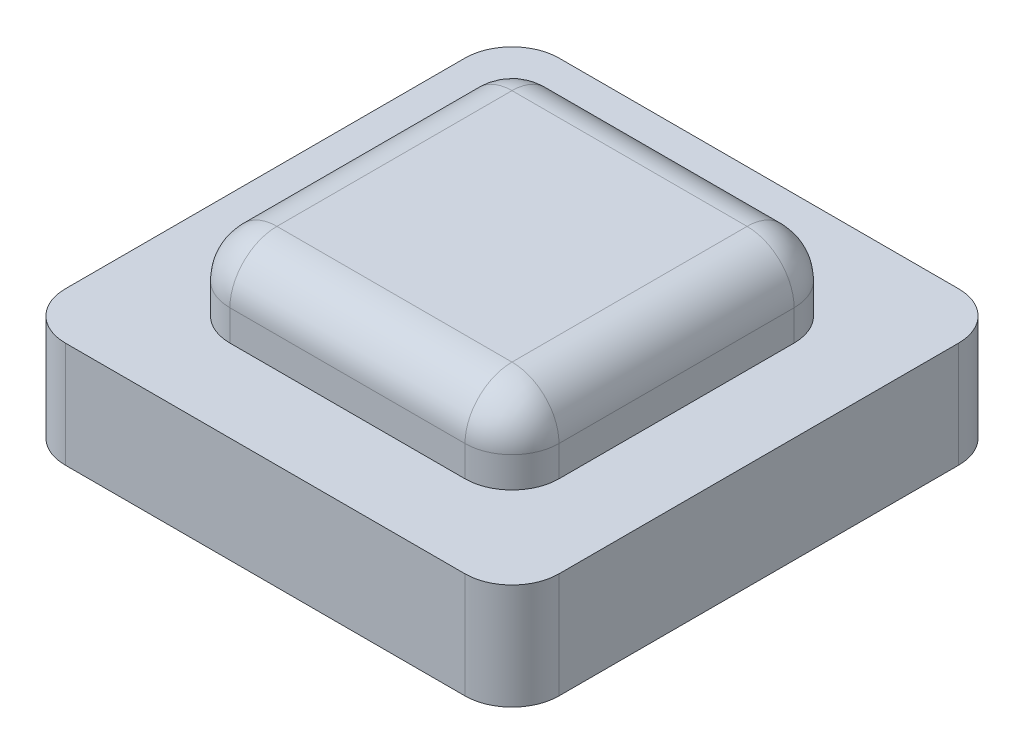
ISO-10303-21;
HEADER;
FILE_DESCRIPTION(('STEP AP214'),'2;1');
FILE_NAME('part.step','',(''),(''),'','','');
FILE_SCHEMA(('AUTOMOTIVE_DESIGN { 1 0 10303 214 1 1 1 1 }'));
ENDSEC;
DATA;
#1=APPLICATION_CONTEXT('core data for automotive mechanical design processes');
#2=APPLICATION_PROTOCOL_DEFINITION('international standard','automotive_design',2000,#1);
#3=PRODUCT_CONTEXT('',#1,'mechanical');
#4=PRODUCT('Part','Part','',(#3));
#5=PRODUCT_RELATED_PRODUCT_CATEGORY('part','',(#4));
#6=PRODUCT_DEFINITION_FORMATION('','',#4);
#7=PRODUCT_DEFINITION_CONTEXT('part definition',#1,'design');
#8=PRODUCT_DEFINITION('design','',#6,#7);
#9=PRODUCT_DEFINITION_SHAPE('','',#8);
#10=(LENGTH_UNIT() NAMED_UNIT(*) SI_UNIT(.MILLI.,.METRE.));
#11=(NAMED_UNIT(*) PLANE_ANGLE_UNIT() SI_UNIT($,.RADIAN.));
#12=(NAMED_UNIT(*) SI_UNIT($,.STERADIAN.) SOLID_ANGLE_UNIT());
#13=UNCERTAINTY_MEASURE_WITH_UNIT(LENGTH_MEASURE(1.E-05),#10,'distance_accuracy_value','');
#14=(GEOMETRIC_REPRESENTATION_CONTEXT(3) GLOBAL_UNCERTAINTY_ASSIGNED_CONTEXT((#13)) GLOBAL_UNIT_ASSIGNED_CONTEXT((#10,
#11,#12)) REPRESENTATION_CONTEXT('',''));
#15=CARTESIAN_POINT('',(0.,0.,0.));
#16=DIRECTION('',(0.,0.,1.));
#17=DIRECTION('',(1.,0.,0.));
#18=AXIS2_PLACEMENT_3D('',#15,#16,#17);
#19=CARTESIAN_POINT('',(0.,0.,0.));
#20=DIRECTION('',(0.,1.,0.));
#21=DIRECTION('',(0.,0.,1.));
#22=AXIS2_PLACEMENT_3D('',#19,#20,#21);
#23=PLANE('',#22);
#24=DIRECTION('',(0.,0.,1.));
#25=VECTOR('',#24,1.);
#26=CARTESIAN_POINT('',(-10.5,0.,-10.5));
#27=LINE('',#26,#25);
#28=CARTESIAN_POINT('',(-10.5,0.,-8.5));
#29=VERTEX_POINT('',#28);
#30=CARTESIAN_POINT('',(-10.5,0.,8.49999999999999));
#31=VERTEX_POINT('',#30);
#32=EDGE_CURVE('E240',#29,#31,#27,.T.);
#33=ORIENTED_EDGE('',*,*,#32,.F.);
#34=CARTESIAN_POINT('',(-8.5,0.,-8.5));
#35=DIRECTION('',(0.,1.,0.));
#36=DIRECTION('',(0.,0.,1.));
#37=AXIS2_PLACEMENT_3D('',#34,#35,#36);
#38=CIRCLE('',#37,2.);
#39=CARTESIAN_POINT('',(-8.5,0.,-10.5));
#40=VERTEX_POINT('',#39);
#41=EDGE_CURVE('E223',#29,#40,#38,.F.);
#42=ORIENTED_EDGE('',*,*,#41,.T.);
#43=DIRECTION('',(-1.,0.,0.));
#44=VECTOR('',#43,1.);
#45=CARTESIAN_POINT('',(-10.5,0.,-10.5));
#46=LINE('',#45,#44);
#47=CARTESIAN_POINT('',(8.49999999999999,0.,-10.5));
#48=VERTEX_POINT('',#47);
#49=EDGE_CURVE('E250',#48,#40,#46,.T.);
#50=ORIENTED_EDGE('',*,*,#49,.F.);
#51=CARTESIAN_POINT('',(8.5,0.,-8.5));
#52=DIRECTION('',(0.,1.,0.));
#53=DIRECTION('',(0.,0.,1.));
#54=AXIS2_PLACEMENT_3D('',#51,#52,#53);
#55=CIRCLE('',#54,2.);
#56=CARTESIAN_POINT('',(10.5,0.,-8.5));
#57=VERTEX_POINT('',#56);
#58=EDGE_CURVE('E234',#48,#57,#55,.F.);
#59=ORIENTED_EDGE('',*,*,#58,.T.);
#60=DIRECTION('',(0.,0.,-1.));
#61=VECTOR('',#60,1.);
#62=CARTESIAN_POINT('',(10.5,0.,-10.5));
#63=LINE('',#62,#61);
#64=CARTESIAN_POINT('',(10.5,0.,8.49999999999999));
#65=VERTEX_POINT('',#64);
#66=EDGE_CURVE('E255',#65,#57,#63,.T.);
#67=ORIENTED_EDGE('',*,*,#66,.F.);
#68=CARTESIAN_POINT('',(8.5,0.,8.5));
#69=DIRECTION('',(0.,1.,0.));
#70=DIRECTION('',(0.,0.,1.));
#71=AXIS2_PLACEMENT_3D('',#68,#69,#70);
#72=CIRCLE('',#71,2.);
#73=CARTESIAN_POINT('',(8.49999999999999,0.,10.5));
#74=VERTEX_POINT('',#73);
#75=EDGE_CURVE('E262',#65,#74,#72,.F.);
#76=ORIENTED_EDGE('',*,*,#75,.T.);
#77=DIRECTION('',(1.,0.,0.));
#78=VECTOR('',#77,1.);
#79=CARTESIAN_POINT('',(-10.5,0.,10.5));
#80=LINE('',#79,#78);
#81=CARTESIAN_POINT('',(-8.5,0.,10.5));
#82=VERTEX_POINT('',#81);
#83=EDGE_CURVE('E249',#82,#74,#80,.T.);
#84=ORIENTED_EDGE('',*,*,#83,.F.);
#85=CARTESIAN_POINT('',(-8.5,0.,8.5));
#86=DIRECTION('',(0.,1.,0.));
#87=DIRECTION('',(0.,0.,1.));
#88=AXIS2_PLACEMENT_3D('',#85,#86,#87);
#89=CIRCLE('',#88,2.);
#90=EDGE_CURVE('E244',#82,#31,#89,.F.);
#91=ORIENTED_EDGE('',*,*,#90,.T.);
#92=EDGE_LOOP('',(#33,#42,#50,#59,#67,#76,#84,#91));
#93=FACE_BOUND('',#92,.T.);
#94=DIRECTION('',(0.,0.,1.));
#95=VECTOR('',#94,1.);
#96=CARTESIAN_POINT('',(4.75,0.,4.75));
#97=LINE('',#96,#95);
#98=CARTESIAN_POINT('',(4.75,0.,-2.75));
#99=VERTEX_POINT('',#98);
#100=CARTESIAN_POINT('',(4.75,0.,2.75));
#101=VERTEX_POINT('',#100);
#102=EDGE_CURVE('E453',#99,#101,#97,.T.);
#103=ORIENTED_EDGE('',*,*,#102,.F.);
#104=CARTESIAN_POINT('',(2.75,0.,-2.75));
#105=DIRECTION('',(0.,1.,0.));
#106=DIRECTION('',(0.,0.,1.));
#107=AXIS2_PLACEMENT_3D('',#104,#105,#106);
#108=CIRCLE('',#107,2.);
#109=CARTESIAN_POINT('',(2.75,0.,-4.75));
#110=VERTEX_POINT('',#109);
#111=EDGE_CURVE('E11',#99,#110,#108,.T.);
#112=ORIENTED_EDGE('',*,*,#111,.T.);
#113=DIRECTION('',(1.,0.,0.));
#114=VECTOR('',#113,1.);
#115=CARTESIAN_POINT('',(-4.75,0.,-4.75));
#116=LINE('',#115,#114);
#117=CARTESIAN_POINT('',(-2.75,0.,-4.75));
#118=VERTEX_POINT('',#117);
#119=EDGE_CURVE('E456',#118,#110,#116,.T.);
#120=ORIENTED_EDGE('',*,*,#119,.F.);
#121=CARTESIAN_POINT('',(-2.75,0.,-2.75));
#122=DIRECTION('',(0.,1.,0.));
#123=DIRECTION('',(0.,0.,1.));
#124=AXIS2_PLACEMENT_3D('',#121,#122,#123);
#125=CIRCLE('',#124,2.);
#126=CARTESIAN_POINT('',(-4.75,0.,-2.75));
#127=VERTEX_POINT('',#126);
#128=EDGE_CURVE('E394',#118,#127,#125,.T.);
#129=ORIENTED_EDGE('',*,*,#128,.T.);
#130=DIRECTION('',(0.,0.,-1.));
#131=VECTOR('',#130,1.);
#132=CARTESIAN_POINT('',(-4.75,0.,4.75));
#133=LINE('',#132,#131);
#134=CARTESIAN_POINT('',(-4.75,0.,2.75));
#135=VERTEX_POINT('',#134);
#136=EDGE_CURVE('E452',#135,#127,#133,.T.);
#137=ORIENTED_EDGE('',*,*,#136,.F.);
#138=CARTESIAN_POINT('',(-2.75,0.,2.75));
#139=DIRECTION('',(0.,1.,0.));
#140=DIRECTION('',(0.,0.,1.));
#141=AXIS2_PLACEMENT_3D('',#138,#139,#140);
#142=CIRCLE('',#141,2.);
#143=CARTESIAN_POINT('',(-2.75,0.,4.75));
#144=VERTEX_POINT('',#143);
#145=EDGE_CURVE('E396',#135,#144,#142,.T.);
#146=ORIENTED_EDGE('',*,*,#145,.T.);
#147=DIRECTION('',(-1.,0.,0.));
#148=VECTOR('',#147,1.);
#149=CARTESIAN_POINT('',(-4.75,0.,4.75));
#150=LINE('',#149,#148);
#151=CARTESIAN_POINT('',(2.75,0.,4.75));
#152=VERTEX_POINT('',#151);
#153=EDGE_CURVE('E446',#152,#144,#150,.T.);
#154=ORIENTED_EDGE('',*,*,#153,.F.);
#155=CARTESIAN_POINT('',(2.75,0.,2.75));
#156=DIRECTION('',(0.,1.,0.));
#157=DIRECTION('',(0.,0.,1.));
#158=AXIS2_PLACEMENT_3D('',#155,#156,#157);
#159=CIRCLE('',#158,2.);
#160=EDGE_CURVE('E46',#152,#101,#159,.T.);
#161=ORIENTED_EDGE('',*,*,#160,.T.);
#162=EDGE_LOOP('',(#103,#112,#120,#129,#137,#146,#154,#161));
#163=FACE_BOUND('',#162,.T.);
#164=ADVANCED_FACE('F37',(#93,#163),#23,.F.);
#165=CARTESIAN_POINT('',(10.5,4.5,-10.5));
#166=DIRECTION('',(-1.,0.,0.));
#167=DIRECTION('',(0.,0.,1.));
#168=AXIS2_PLACEMENT_3D('',#165,#166,#167);
#169=PLANE('',#168);
#170=ORIENTED_EDGE('',*,*,#66,.T.);
#171=DIRECTION('',(0.,-1.,0.));
#172=VECTOR('',#171,1.);
#173=CARTESIAN_POINT('',(10.5,4.5,-8.5));
#174=LINE('',#173,#172);
#175=CARTESIAN_POINT('',(10.5,4.5,-8.5));
#176=VERTEX_POINT('',#175);
#177=EDGE_CURVE('E279',#57,#176,#174,.F.);
#178=ORIENTED_EDGE('',*,*,#177,.T.);
#179=DIRECTION('',(0.,0.,-1.));
#180=VECTOR('',#179,1.);
#181=CARTESIAN_POINT('',(10.5,4.5,-10.5));
#182=LINE('',#181,#180);
#183=CARTESIAN_POINT('',(10.5,4.5,8.49999999999999));
#184=VERTEX_POINT('',#183);
#185=EDGE_CURVE('E253',#184,#176,#182,.T.);
#186=ORIENTED_EDGE('',*,*,#185,.F.);
#187=DIRECTION('',(0.,-1.,0.));
#188=VECTOR('',#187,1.);
#189=CARTESIAN_POINT('',(10.5,4.5,8.5));
#190=LINE('',#189,#188);
#191=EDGE_CURVE('E276',#184,#65,#190,.T.);
#192=ORIENTED_EDGE('',*,*,#191,.T.);
#193=EDGE_LOOP('',(#170,#178,#186,#192));
#194=FACE_BOUND('',#193,.T.);
#195=ADVANCED_FACE('F475',(#194),#169,.F.);
#196=CARTESIAN_POINT('',(-10.5,4.5,-10.5));
#197=DIRECTION('',(0.,0.,1.));
#198=DIRECTION('',(1.,0.,0.));
#199=AXIS2_PLACEMENT_3D('',#196,#197,#198);
#200=PLANE('',#199);
#201=ORIENTED_EDGE('',*,*,#49,.T.);
#202=DIRECTION('',(0.,-1.,0.));
#203=VECTOR('',#202,1.);
#204=CARTESIAN_POINT('',(-8.5,4.5,-10.5));
#205=LINE('',#204,#203);
#206=CARTESIAN_POINT('',(-8.5,4.5,-10.5));
#207=VERTEX_POINT('',#206);
#208=EDGE_CURVE('E228',#40,#207,#205,.F.);
#209=ORIENTED_EDGE('',*,*,#208,.T.);
#210=DIRECTION('',(-1.,0.,0.));
#211=VECTOR('',#210,1.);
#212=CARTESIAN_POINT('',(-10.5,4.5,-10.5));
#213=LINE('',#212,#211);
#214=CARTESIAN_POINT('',(8.49999999999999,4.5,-10.5));
#215=VERTEX_POINT('',#214);
#216=EDGE_CURVE('E466',#215,#207,#213,.T.);
#217=ORIENTED_EDGE('',*,*,#216,.F.);
#218=DIRECTION('',(0.,-1.,0.));
#219=VECTOR('',#218,1.);
#220=CARTESIAN_POINT('',(8.5,4.5,-10.5));
#221=LINE('',#220,#219);
#222=EDGE_CURVE('E233',#215,#48,#221,.T.);
#223=ORIENTED_EDGE('',*,*,#222,.T.);
#224=EDGE_LOOP('',(#201,#209,#217,#223));
#225=FACE_BOUND('',#224,.T.);
#226=ADVANCED_FACE('F486',(#225),#200,.F.);
#227=CARTESIAN_POINT('',(-10.5,4.5,-10.5));
#228=DIRECTION('',(1.,0.,0.));
#229=DIRECTION('',(0.,0.,-1.));
#230=AXIS2_PLACEMENT_3D('',#227,#228,#229);
#231=PLANE('',#230);
#232=DIRECTION('',(0.,0.,1.));
#233=VECTOR('',#232,1.);
#234=CARTESIAN_POINT('',(-10.5,4.5,-10.5));
#235=LINE('',#234,#233);
#236=CARTESIAN_POINT('',(-10.5,4.5,-8.5));
#237=VERTEX_POINT('',#236);
#238=CARTESIAN_POINT('',(-10.5,4.5,8.49999999999999));
#239=VERTEX_POINT('',#238);
#240=EDGE_CURVE('E243',#237,#239,#235,.T.);
#241=ORIENTED_EDGE('',*,*,#240,.F.);
#242=DIRECTION('',(0.,-1.,0.));
#243=VECTOR('',#242,1.);
#244=CARTESIAN_POINT('',(-10.5,4.5,-8.5));
#245=LINE('',#244,#243);
#246=EDGE_CURVE('E227',#237,#29,#245,.T.);
#247=ORIENTED_EDGE('',*,*,#246,.T.);
#248=ORIENTED_EDGE('',*,*,#32,.T.);
#249=DIRECTION('',(0.,-1.,0.));
#250=VECTOR('',#249,1.);
#251=CARTESIAN_POINT('',(-10.5,4.5,8.5));
#252=LINE('',#251,#250);
#253=EDGE_CURVE('E245',#31,#239,#252,.F.);
#254=ORIENTED_EDGE('',*,*,#253,.T.);
#255=EDGE_LOOP('',(#241,#247,#248,#254));
#256=FACE_BOUND('',#255,.T.);
#257=ADVANCED_FACE('F239',(#256),#231,.F.);
#258=CARTESIAN_POINT('',(-10.5,4.5,10.5));
#259=DIRECTION('',(0.,0.,-1.));
#260=DIRECTION('',(-1.,0.,0.));
#261=AXIS2_PLACEMENT_3D('',#258,#259,#260);
#262=PLANE('',#261);
#263=ORIENTED_EDGE('',*,*,#83,.T.);
#264=DIRECTION('',(0.,-1.,0.));
#265=VECTOR('',#264,1.);
#266=CARTESIAN_POINT('',(8.5,4.5,10.5));
#267=LINE('',#266,#265);
#268=CARTESIAN_POINT('',(8.49999999999999,4.5,10.5));
#269=VERTEX_POINT('',#268);
#270=EDGE_CURVE('E284',#74,#269,#267,.F.);
#271=ORIENTED_EDGE('',*,*,#270,.T.);
#272=DIRECTION('',(1.,0.,0.));
#273=VECTOR('',#272,1.);
#274=CARTESIAN_POINT('',(-10.5,4.5,10.5));
#275=LINE('',#274,#273);
#276=CARTESIAN_POINT('',(-8.5,4.5,10.5));
#277=VERTEX_POINT('',#276);
#278=EDGE_CURVE('E259',#277,#269,#275,.T.);
#279=ORIENTED_EDGE('',*,*,#278,.F.);
#280=DIRECTION('',(0.,-1.,0.));
#281=VECTOR('',#280,1.);
#282=CARTESIAN_POINT('',(-8.5,4.5,10.5));
#283=LINE('',#282,#281);
#284=EDGE_CURVE('E281',#277,#82,#283,.T.);
#285=ORIENTED_EDGE('',*,*,#284,.T.);
#286=EDGE_LOOP('',(#263,#271,#279,#285));
#287=FACE_BOUND('',#286,.T.);
#288=ADVANCED_FACE('F493',(#287),#262,.F.);
#289=CARTESIAN_POINT('',(0.,4.5,0.));
#290=DIRECTION('',(0.,1.,0.));
#291=DIRECTION('',(0.,0.,1.));
#292=AXIS2_PLACEMENT_3D('',#289,#290,#291);
#293=PLANE('',#292);
#294=DIRECTION('',(0.,0.,-1.));
#295=VECTOR('',#294,1.);
#296=CARTESIAN_POINT('',(7.,4.5,-7.));
#297=LINE('',#296,#295);
#298=CARTESIAN_POINT('',(7.,4.5,5.));
#299=VERTEX_POINT('',#298);
#300=CARTESIAN_POINT('',(7.,4.5,-5.));
#301=VERTEX_POINT('',#300);
#302=EDGE_CURVE('E363',#299,#301,#297,.T.);
#303=ORIENTED_EDGE('',*,*,#302,.F.);
#304=CARTESIAN_POINT('',(5.,4.5,5.));
#305=DIRECTION('',(0.,1.,0.));
#306=DIRECTION('',(0.,0.,1.));
#307=AXIS2_PLACEMENT_3D('',#304,#305,#306);
#308=CIRCLE('',#307,2.);
#309=CARTESIAN_POINT('',(5.,4.5,7.));
#310=VERTEX_POINT('',#309);
#311=EDGE_CURVE('E326',#299,#310,#308,.F.);
#312=ORIENTED_EDGE('',*,*,#311,.T.);
#313=DIRECTION('',(1.,0.,0.));
#314=VECTOR('',#313,1.);
#315=CARTESIAN_POINT('',(-7.,4.5,7.));
#316=LINE('',#315,#314);
#317=CARTESIAN_POINT('',(-5.,4.5,7.));
#318=VERTEX_POINT('',#317);
#319=EDGE_CURVE('E458',#318,#310,#316,.T.);
#320=ORIENTED_EDGE('',*,*,#319,.F.);
#321=CARTESIAN_POINT('',(-5.,4.5,5.));
#322=DIRECTION('',(0.,1.,0.));
#323=DIRECTION('',(0.,0.,1.));
#324=AXIS2_PLACEMENT_3D('',#321,#322,#323);
#325=CIRCLE('',#324,2.);
#326=CARTESIAN_POINT('',(-7.,4.5,5.));
#327=VERTEX_POINT('',#326);
#328=EDGE_CURVE('E320',#318,#327,#325,.F.);
#329=ORIENTED_EDGE('',*,*,#328,.T.);
#330=DIRECTION('',(0.,0.,1.));
#331=VECTOR('',#330,1.);
#332=CARTESIAN_POINT('',(-7.,4.5,-7.));
#333=LINE('',#332,#331);
#334=CARTESIAN_POINT('',(-7.,4.5,-5.));
#335=VERTEX_POINT('',#334);
#336=EDGE_CURVE('E1037',#335,#327,#333,.T.);
#337=ORIENTED_EDGE('',*,*,#336,.F.);
#338=CARTESIAN_POINT('',(-5.,4.5,-5.));
#339=DIRECTION('',(0.,1.,0.));
#340=DIRECTION('',(0.,0.,1.));
#341=AXIS2_PLACEMENT_3D('',#338,#339,#340);
#342=CIRCLE('',#341,2.);
#343=CARTESIAN_POINT('',(-5.,4.5,-7.));
#344=VERTEX_POINT('',#343);
#345=EDGE_CURVE('E322',#335,#344,#342,.F.);
#346=ORIENTED_EDGE('',*,*,#345,.T.);
#347=DIRECTION('',(-1.,0.,0.));
#348=VECTOR('',#347,1.);
#349=CARTESIAN_POINT('',(-7.,4.5,-7.));
#350=LINE('',#349,#348);
#351=CARTESIAN_POINT('',(5.,4.5,-7.));
#352=VERTEX_POINT('',#351);
#353=EDGE_CURVE('E1021',#352,#344,#350,.T.);
#354=ORIENTED_EDGE('',*,*,#353,.F.);
#355=CARTESIAN_POINT('',(5.,4.5,-5.));
#356=DIRECTION('',(0.,1.,0.));
#357=DIRECTION('',(0.,0.,1.));
#358=AXIS2_PLACEMENT_3D('',#355,#356,#357);
#359=CIRCLE('',#358,2.);
#360=EDGE_CURVE('E324',#352,#301,#359,.F.);
#361=ORIENTED_EDGE('',*,*,#360,.T.);
#362=EDGE_LOOP('',(#303,#312,#320,#329,#337,#346,#354,#361));
#363=FACE_BOUND('',#362,.T.);
#364=ORIENTED_EDGE('',*,*,#216,.T.);
#365=CARTESIAN_POINT('',(-8.5,4.5,-8.5));
#366=DIRECTION('',(0.,1.,0.));
#367=DIRECTION('',(0.,0.,1.));
#368=AXIS2_PLACEMENT_3D('',#365,#366,#367);
#369=CIRCLE('',#368,2.);
#370=EDGE_CURVE('E274',#207,#237,#369,.T.);
#371=ORIENTED_EDGE('',*,*,#370,.T.);
#372=ORIENTED_EDGE('',*,*,#240,.T.);
#373=CARTESIAN_POINT('',(-8.5,4.5,8.5));
#374=DIRECTION('',(0.,1.,0.));
#375=DIRECTION('',(0.,0.,1.));
#376=AXIS2_PLACEMENT_3D('',#373,#374,#375);
#377=CIRCLE('',#376,2.);
#378=EDGE_CURVE('E268',#239,#277,#377,.T.);
#379=ORIENTED_EDGE('',*,*,#378,.T.);
#380=ORIENTED_EDGE('',*,*,#278,.T.);
#381=CARTESIAN_POINT('',(8.5,4.5,8.5));
#382=DIRECTION('',(0.,1.,0.));
#383=DIRECTION('',(0.,0.,1.));
#384=AXIS2_PLACEMENT_3D('',#381,#382,#383);
#385=CIRCLE('',#384,2.);
#386=EDGE_CURVE('E270',#269,#184,#385,.T.);
#387=ORIENTED_EDGE('',*,*,#386,.T.);
#388=ORIENTED_EDGE('',*,*,#185,.T.);
#389=CARTESIAN_POINT('',(8.5,4.5,-8.5));
#390=DIRECTION('',(0.,1.,0.));
#391=DIRECTION('',(0.,0.,1.));
#392=AXIS2_PLACEMENT_3D('',#389,#390,#391);
#393=CIRCLE('',#392,2.);
#394=EDGE_CURVE('E272',#176,#215,#393,.T.);
#395=ORIENTED_EDGE('',*,*,#394,.T.);
#396=EDGE_LOOP('',(#364,#371,#372,#379,#380,#387,#388,#395));
#397=FACE_BOUND('',#396,.T.);
#398=ADVANCED_FACE('F484',(#363,#397),#293,.T.);
#399=CARTESIAN_POINT('',(4.75,-3.5,4.75));
#400=DIRECTION('',(-1.,0.,0.));
#401=DIRECTION('',(0.,0.,1.));
#402=AXIS2_PLACEMENT_3D('',#399,#400,#401);
#403=PLANE('',#402);
#404=ORIENTED_EDGE('',*,*,#102,.T.);
#405=DIRECTION('',(0.,1.,0.));
#406=VECTOR('',#405,1.);
#407=CARTESIAN_POINT('',(4.75,-3.5,2.75));
#408=LINE('',#407,#406);
#409=CARTESIAN_POINT('',(4.75,-1.5,2.75));
#410=VERTEX_POINT('',#409);
#411=EDGE_CURVE('E386',#101,#410,#408,.F.);
#412=ORIENTED_EDGE('',*,*,#411,.T.);
#413=DIRECTION('',(0.,0.,1.));
#414=VECTOR('',#413,1.);
#415=CARTESIAN_POINT('',(4.75,-1.5,-4.75));
#416=LINE('',#415,#414);
#417=CARTESIAN_POINT('',(4.75,-1.5,-2.75));
#418=VERTEX_POINT('',#417);
#419=EDGE_CURVE('E382',#410,#418,#416,.F.);
#420=ORIENTED_EDGE('',*,*,#419,.T.);
#421=DIRECTION('',(0.,1.,0.));
#422=VECTOR('',#421,1.);
#423=CARTESIAN_POINT('',(4.75,-3.5,-2.75));
#424=LINE('',#423,#422);
#425=EDGE_CURVE('E384',#418,#99,#424,.T.);
#426=ORIENTED_EDGE('',*,*,#425,.T.);
#427=EDGE_LOOP('',(#404,#412,#420,#426));
#428=FACE_BOUND('',#427,.T.);
#429=ADVANCED_FACE('F508',(#428),#403,.F.);
#430=CARTESIAN_POINT('',(-4.75,-3.5,4.75));
#431=DIRECTION('',(0.,0.,-1.));
#432=DIRECTION('',(-1.,0.,0.));
#433=AXIS2_PLACEMENT_3D('',#430,#431,#432);
#434=PLANE('',#433);
#435=ORIENTED_EDGE('',*,*,#153,.T.);
#436=DIRECTION('',(0.,1.,0.));
#437=VECTOR('',#436,1.);
#438=CARTESIAN_POINT('',(-2.75,-3.5,4.75));
#439=LINE('',#438,#437);
#440=CARTESIAN_POINT('',(-2.75,-1.5,4.75));
#441=VERTEX_POINT('',#440);
#442=EDGE_CURVE('E380',#144,#441,#439,.F.);
#443=ORIENTED_EDGE('',*,*,#442,.T.);
#444=DIRECTION('',(-1.,0.,0.));
#445=VECTOR('',#444,1.);
#446=CARTESIAN_POINT('',(4.75,-1.5,4.75));
#447=LINE('',#446,#445);
#448=CARTESIAN_POINT('',(2.75,-1.5,4.75));
#449=VERTEX_POINT('',#448);
#450=EDGE_CURVE('E376',#441,#449,#447,.F.);
#451=ORIENTED_EDGE('',*,*,#450,.T.);
#452=DIRECTION('',(0.,1.,0.));
#453=VECTOR('',#452,1.);
#454=CARTESIAN_POINT('',(2.75,-3.5,4.75));
#455=LINE('',#454,#453);
#456=EDGE_CURVE('E378',#449,#152,#455,.T.);
#457=ORIENTED_EDGE('',*,*,#456,.T.);
#458=EDGE_LOOP('',(#435,#443,#451,#457));
#459=FACE_BOUND('',#458,.T.);
#460=ADVANCED_FACE('F445',(#459),#434,.F.);
#461=CARTESIAN_POINT('',(-4.75,-3.5,4.75));
#462=DIRECTION('',(1.,0.,0.));
#463=DIRECTION('',(0.,0.,-1.));
#464=AXIS2_PLACEMENT_3D('',#461,#462,#463);
#465=PLANE('',#464);
#466=ORIENTED_EDGE('',*,*,#136,.T.);
#467=DIRECTION('',(0.,1.,0.));
#468=VECTOR('',#467,1.);
#469=CARTESIAN_POINT('',(-4.75,-3.5,-2.75));
#470=LINE('',#469,#468);
#471=CARTESIAN_POINT('',(-4.75,-1.5,-2.75));
#472=VERTEX_POINT('',#471);
#473=EDGE_CURVE('E374',#127,#472,#470,.F.);
#474=ORIENTED_EDGE('',*,*,#473,.T.);
#475=DIRECTION('',(0.,0.,-1.));
#476=VECTOR('',#475,1.);
#477=CARTESIAN_POINT('',(-4.75,-1.5,4.75));
#478=LINE('',#477,#476);
#479=CARTESIAN_POINT('',(-4.75,-1.5,2.75));
#480=VERTEX_POINT('',#479);
#481=EDGE_CURVE('E370',#472,#480,#478,.F.);
#482=ORIENTED_EDGE('',*,*,#481,.T.);
#483=DIRECTION('',(0.,1.,0.));
#484=VECTOR('',#483,1.);
#485=CARTESIAN_POINT('',(-4.75,-3.5,2.75));
#486=LINE('',#485,#484);
#487=EDGE_CURVE('E372',#480,#135,#486,.T.);
#488=ORIENTED_EDGE('',*,*,#487,.T.);
#489=EDGE_LOOP('',(#466,#474,#482,#488));
#490=FACE_BOUND('',#489,.T.);
#491=ADVANCED_FACE('F815',(#490),#465,.F.);
#492=CARTESIAN_POINT('',(-4.75,-3.5,-4.75));
#493=DIRECTION('',(0.,0.,1.));
#494=DIRECTION('',(1.,0.,0.));
#495=AXIS2_PLACEMENT_3D('',#492,#493,#494);
#496=PLANE('',#495);
#497=DIRECTION('',(1.,0.,0.));
#498=VECTOR('',#497,1.);
#499=CARTESIAN_POINT('',(-4.75,-1.5,-4.75));
#500=LINE('',#499,#498);
#501=CARTESIAN_POINT('',(2.75,-1.5,-4.75));
#502=VERTEX_POINT('',#501);
#503=CARTESIAN_POINT('',(-2.75,-1.5,-4.75));
#504=VERTEX_POINT('',#503);
#505=EDGE_CURVE('E328',#502,#504,#500,.F.);
#506=ORIENTED_EDGE('',*,*,#505,.T.);
#507=DIRECTION('',(0.,1.,0.));
#508=VECTOR('',#507,1.);
#509=CARTESIAN_POINT('',(-2.75,-3.5,-4.75));
#510=LINE('',#509,#508);
#511=EDGE_CURVE('E367',#504,#118,#510,.T.);
#512=ORIENTED_EDGE('',*,*,#511,.T.);
#513=ORIENTED_EDGE('',*,*,#119,.T.);
#514=DIRECTION('',(0.,1.,0.));
#515=VECTOR('',#514,1.);
#516=CARTESIAN_POINT('',(2.75,-3.5,-4.75));
#517=LINE('',#516,#515);
#518=EDGE_CURVE('E365',#110,#502,#517,.F.);
#519=ORIENTED_EDGE('',*,*,#518,.T.);
#520=EDGE_LOOP('',(#506,#512,#513,#519));
#521=FACE_BOUND('',#520,.T.);
#522=ADVANCED_FACE('F824',(#521),#496,.F.);
#523=CARTESIAN_POINT('',(0.,-3.5,0.));
#524=DIRECTION('',(0.,-1.,0.));
#525=DIRECTION('',(0.,0.,-1.));
#526=AXIS2_PLACEMENT_3D('',#523,#524,#525);
#527=PLANE('',#526);
#528=DIRECTION('',(0.,0.,-1.));
#529=VECTOR('',#528,1.);
#530=CARTESIAN_POINT('',(-2.75,-3.5,-4.75));
#531=LINE('',#530,#529);
#532=CARTESIAN_POINT('',(-2.75,-3.5,2.75));
#533=VERTEX_POINT('',#532);
#534=CARTESIAN_POINT('',(-2.75,-3.5,-2.75));
#535=VERTEX_POINT('',#534);
#536=EDGE_CURVE('E54',#533,#535,#531,.T.);
#537=ORIENTED_EDGE('',*,*,#536,.T.);
#538=DIRECTION('',(1.,0.,0.));
#539=VECTOR('',#538,1.);
#540=CARTESIAN_POINT('',(4.75,-3.5,-2.75));
#541=LINE('',#540,#539);
#542=CARTESIAN_POINT('',(2.75,-3.5,-2.75));
#543=VERTEX_POINT('',#542);
#544=EDGE_CURVE('E392',#535,#543,#541,.T.);
#545=ORIENTED_EDGE('',*,*,#544,.T.);
#546=DIRECTION('',(0.,0.,1.));
#547=VECTOR('',#546,1.);
#548=CARTESIAN_POINT('',(2.75,-3.5,4.75));
#549=LINE('',#548,#547);
#550=CARTESIAN_POINT('',(2.75,-3.5,2.75));
#551=VERTEX_POINT('',#550);
#552=EDGE_CURVE('E388',#543,#551,#549,.T.);
#553=ORIENTED_EDGE('',*,*,#552,.T.);
#554=DIRECTION('',(-1.,0.,0.));
#555=VECTOR('',#554,1.);
#556=CARTESIAN_POINT('',(-4.75,-3.5,2.75));
#557=LINE('',#556,#555);
#558=EDGE_CURVE('E59',#551,#533,#557,.T.);
#559=ORIENTED_EDGE('',*,*,#558,.T.);
#560=EDGE_LOOP('',(#537,#545,#553,#559));
#561=FACE_BOUND('',#560,.T.);
#562=ADVANCED_FACE('F726',(#561),#527,.T.);
#563=CARTESIAN_POINT('',(7.,7.8,-7.));
#564=DIRECTION('',(-1.,0.,0.));
#565=DIRECTION('',(0.,0.,1.));
#566=AXIS2_PLACEMENT_3D('',#563,#564,#565);
#567=PLANE('',#566);
#568=ORIENTED_EDGE('',*,*,#302,.T.);
#569=DIRECTION('',(0.,-1.,0.));
#570=VECTOR('',#569,1.);
#571=CARTESIAN_POINT('',(7.,7.8,-5.));
#572=LINE('',#571,#570);
#573=CARTESIAN_POINT('',(7.,5.8,-5.));
#574=VERTEX_POINT('',#573);
#575=EDGE_CURVE('E306',#301,#574,#572,.F.);
#576=ORIENTED_EDGE('',*,*,#575,.T.);
#577=DIRECTION('',(0.,0.,-1.));
#578=VECTOR('',#577,1.);
#579=CARTESIAN_POINT('',(7.,5.8,7.));
#580=LINE('',#579,#578);
#581=CARTESIAN_POINT('',(7.,5.8,5.));
#582=VERTEX_POINT('',#581);
#583=EDGE_CURVE('E304',#574,#582,#580,.F.);
#584=ORIENTED_EDGE('',*,*,#583,.T.);
#585=DIRECTION('',(0.,-1.,0.));
#586=VECTOR('',#585,1.);
#587=CARTESIAN_POINT('',(7.,7.8,5.));
#588=LINE('',#587,#586);
#589=EDGE_CURVE('E302',#582,#299,#588,.T.);
#590=ORIENTED_EDGE('',*,*,#589,.T.);
#591=EDGE_LOOP('',(#568,#576,#584,#590));
#592=FACE_BOUND('',#591,.T.);
#593=ADVANCED_FACE('F715',(#592),#567,.F.);
#594=CARTESIAN_POINT('',(-7.,7.8,-7.));
#595=DIRECTION('',(0.,0.,1.));
#596=DIRECTION('',(1.,0.,0.));
#597=AXIS2_PLACEMENT_3D('',#594,#595,#596);
#598=PLANE('',#597);
#599=ORIENTED_EDGE('',*,*,#353,.T.);
#600=DIRECTION('',(0.,-1.,0.));
#601=VECTOR('',#600,1.);
#602=CARTESIAN_POINT('',(-5.,7.8,-7.));
#603=LINE('',#602,#601);
#604=CARTESIAN_POINT('',(-5.,5.8,-7.));
#605=VERTEX_POINT('',#604);
#606=EDGE_CURVE('E312',#344,#605,#603,.F.);
#607=ORIENTED_EDGE('',*,*,#606,.T.);
#608=DIRECTION('',(-1.,0.,0.));
#609=VECTOR('',#608,1.);
#610=CARTESIAN_POINT('',(7.,5.8,-7.));
#611=LINE('',#610,#609);
#612=CARTESIAN_POINT('',(5.,5.8,-7.));
#613=VERTEX_POINT('',#612);
#614=EDGE_CURVE('E310',#605,#613,#611,.F.);
#615=ORIENTED_EDGE('',*,*,#614,.T.);
#616=DIRECTION('',(0.,-1.,0.));
#617=VECTOR('',#616,1.);
#618=CARTESIAN_POINT('',(5.,7.8,-7.));
#619=LINE('',#618,#617);
#620=EDGE_CURVE('E308',#613,#352,#619,.T.);
#621=ORIENTED_EDGE('',*,*,#620,.T.);
#622=EDGE_LOOP('',(#599,#607,#615,#621));
#623=FACE_BOUND('',#622,.T.);
#624=ADVANCED_FACE('F704',(#623),#598,.F.);
#625=CARTESIAN_POINT('',(-7.,7.8,-7.));
#626=DIRECTION('',(1.,0.,0.));
#627=DIRECTION('',(0.,0.,-1.));
#628=AXIS2_PLACEMENT_3D('',#625,#626,#627);
#629=PLANE('',#628);
#630=ORIENTED_EDGE('',*,*,#336,.T.);
#631=DIRECTION('',(0.,-1.,0.));
#632=VECTOR('',#631,1.);
#633=CARTESIAN_POINT('',(-7.,7.8,5.));
#634=LINE('',#633,#632);
#635=CARTESIAN_POINT('',(-7.,5.8,5.));
#636=VERTEX_POINT('',#635);
#637=EDGE_CURVE('E318',#327,#636,#634,.F.);
#638=ORIENTED_EDGE('',*,*,#637,.T.);
#639=DIRECTION('',(0.,0.,1.));
#640=VECTOR('',#639,1.);
#641=CARTESIAN_POINT('',(-7.,5.8,-7.));
#642=LINE('',#641,#640);
#643=CARTESIAN_POINT('',(-7.,5.8,-5.));
#644=VERTEX_POINT('',#643);
#645=EDGE_CURVE('E316',#636,#644,#642,.F.);
#646=ORIENTED_EDGE('',*,*,#645,.T.);
#647=DIRECTION('',(0.,-1.,0.));
#648=VECTOR('',#647,1.);
#649=CARTESIAN_POINT('',(-7.,7.8,-5.));
#650=LINE('',#649,#648);
#651=EDGE_CURVE('E314',#644,#335,#650,.T.);
#652=ORIENTED_EDGE('',*,*,#651,.T.);
#653=EDGE_LOOP('',(#630,#638,#646,#652));
#654=FACE_BOUND('',#653,.T.);
#655=ADVANCED_FACE('F693',(#654),#629,.F.);
#656=CARTESIAN_POINT('',(-7.,7.8,7.));
#657=DIRECTION('',(0.,0.,-1.));
#658=DIRECTION('',(-1.,0.,0.));
#659=AXIS2_PLACEMENT_3D('',#656,#657,#658);
#660=PLANE('',#659);
#661=DIRECTION('',(1.,0.,0.));
#662=VECTOR('',#661,1.);
#663=CARTESIAN_POINT('',(-7.,5.8,7.));
#664=LINE('',#663,#662);
#665=CARTESIAN_POINT('',(5.,5.8,7.));
#666=VERTEX_POINT('',#665);
#667=CARTESIAN_POINT('',(-5.,5.8,7.));
#668=VERTEX_POINT('',#667);
#669=EDGE_CURVE('E297',#666,#668,#664,.F.);
#670=ORIENTED_EDGE('',*,*,#669,.T.);
#671=DIRECTION('',(0.,-1.,0.));
#672=VECTOR('',#671,1.);
#673=CARTESIAN_POINT('',(-5.,7.8,7.));
#674=LINE('',#673,#672);
#675=EDGE_CURVE('E300',#668,#318,#674,.T.);
#676=ORIENTED_EDGE('',*,*,#675,.T.);
#677=ORIENTED_EDGE('',*,*,#319,.T.);
#678=DIRECTION('',(0.,-1.,0.));
#679=VECTOR('',#678,1.);
#680=CARTESIAN_POINT('',(5.,7.8,7.));
#681=LINE('',#680,#679);
#682=EDGE_CURVE('E295',#310,#666,#681,.F.);
#683=ORIENTED_EDGE('',*,*,#682,.T.);
#684=EDGE_LOOP('',(#670,#676,#677,#683));
#685=FACE_BOUND('',#684,.T.);
#686=ADVANCED_FACE('F680',(#685),#660,.F.);
#687=CARTESIAN_POINT('',(0.,7.8,0.));
#688=DIRECTION('',(0.,1.,0.));
#689=DIRECTION('',(0.,0.,1.));
#690=AXIS2_PLACEMENT_3D('',#687,#688,#689);
#691=PLANE('',#690);
#692=DIRECTION('',(0.,0.,1.));
#693=VECTOR('',#692,1.);
#694=CARTESIAN_POINT('',(-5.,7.8,7.));
#695=LINE('',#694,#693);
#696=CARTESIAN_POINT('',(-5.,7.8,-5.));
#697=VERTEX_POINT('',#696);
#698=CARTESIAN_POINT('',(-5.,7.8,5.));
#699=VERTEX_POINT('',#698);
#700=EDGE_CURVE('E286',#697,#699,#695,.T.);
#701=ORIENTED_EDGE('',*,*,#700,.T.);
#702=DIRECTION('',(1.,0.,0.));
#703=VECTOR('',#702,1.);
#704=CARTESIAN_POINT('',(7.,7.8,5.));
#705=LINE('',#704,#703);
#706=CARTESIAN_POINT('',(5.,7.8,5.));
#707=VERTEX_POINT('',#706);
#708=EDGE_CURVE('E292',#699,#707,#705,.T.);
#709=ORIENTED_EDGE('',*,*,#708,.T.);
#710=DIRECTION('',(0.,0.,-1.));
#711=VECTOR('',#710,1.);
#712=CARTESIAN_POINT('',(5.,7.8,-7.));
#713=LINE('',#712,#711);
#714=CARTESIAN_POINT('',(5.,7.8,-5.));
#715=VERTEX_POINT('',#714);
#716=EDGE_CURVE('E290',#707,#715,#713,.T.);
#717=ORIENTED_EDGE('',*,*,#716,.T.);
#718=DIRECTION('',(-1.,0.,0.));
#719=VECTOR('',#718,1.);
#720=CARTESIAN_POINT('',(-7.,7.8,-5.));
#721=LINE('',#720,#719);
#722=EDGE_CURVE('E288',#715,#697,#721,.T.);
#723=ORIENTED_EDGE('',*,*,#722,.T.);
#724=EDGE_LOOP('',(#701,#709,#717,#723));
#725=FACE_BOUND('',#724,.T.);
#726=ADVANCED_FACE('F675',(#725),#691,.T.);
#727=CARTESIAN_POINT('',(-8.5,4.5,-8.5));
#728=DIRECTION('',(0.,-1.,0.));
#729=DIRECTION('',(0.,0.,-1.));
#730=AXIS2_PLACEMENT_3D('',#727,#728,#729);
#731=CYLINDRICAL_SURFACE('',#730,2.);
#732=ORIENTED_EDGE('',*,*,#370,.F.);
#733=ORIENTED_EDGE('',*,*,#208,.F.);
#734=ORIENTED_EDGE('',*,*,#41,.F.);
#735=ORIENTED_EDGE('',*,*,#246,.F.);
#736=EDGE_LOOP('',(#732,#733,#734,#735));
#737=FACE_BOUND('',#736,.T.);
#738=ADVANCED_FACE('F226',(#737),#731,.T.);
#739=CARTESIAN_POINT('',(8.5,4.5,-8.5));
#740=DIRECTION('',(0.,-1.,0.));
#741=DIRECTION('',(0.,0.,-1.));
#742=AXIS2_PLACEMENT_3D('',#739,#740,#741);
#743=CYLINDRICAL_SURFACE('',#742,2.);
#744=ORIENTED_EDGE('',*,*,#394,.F.);
#745=ORIENTED_EDGE('',*,*,#177,.F.);
#746=ORIENTED_EDGE('',*,*,#58,.F.);
#747=ORIENTED_EDGE('',*,*,#222,.F.);
#748=EDGE_LOOP('',(#744,#745,#746,#747));
#749=FACE_BOUND('',#748,.T.);
#750=ADVANCED_FACE('F480',(#749),#743,.T.);
#751=CARTESIAN_POINT('',(8.5,4.5,8.5));
#752=DIRECTION('',(0.,-1.,0.));
#753=DIRECTION('',(0.,0.,-1.));
#754=AXIS2_PLACEMENT_3D('',#751,#752,#753);
#755=CYLINDRICAL_SURFACE('',#754,2.);
#756=ORIENTED_EDGE('',*,*,#386,.F.);
#757=ORIENTED_EDGE('',*,*,#270,.F.);
#758=ORIENTED_EDGE('',*,*,#75,.F.);
#759=ORIENTED_EDGE('',*,*,#191,.F.);
#760=EDGE_LOOP('',(#756,#757,#758,#759));
#761=FACE_BOUND('',#760,.T.);
#762=ADVANCED_FACE('F515',(#761),#755,.T.);
#763=CARTESIAN_POINT('',(-8.5,4.5,8.5));
#764=DIRECTION('',(0.,-1.,0.));
#765=DIRECTION('',(0.,0.,-1.));
#766=AXIS2_PLACEMENT_3D('',#763,#764,#765);
#767=CYLINDRICAL_SURFACE('',#766,2.);
#768=ORIENTED_EDGE('',*,*,#378,.F.);
#769=ORIENTED_EDGE('',*,*,#253,.F.);
#770=ORIENTED_EDGE('',*,*,#90,.F.);
#771=ORIENTED_EDGE('',*,*,#284,.F.);
#772=EDGE_LOOP('',(#768,#769,#770,#771));
#773=FACE_BOUND('',#772,.T.);
#774=ADVANCED_FACE('F518',(#773),#767,.T.);
#775=CARTESIAN_POINT('',(-5.,7.8,-5.));
#776=DIRECTION('',(0.,-1.,0.));
#777=DIRECTION('',(0.,0.,-1.));
#778=AXIS2_PLACEMENT_3D('',#775,#776,#777);
#779=CYLINDRICAL_SURFACE('',#778,2.);
#780=ORIENTED_EDGE('',*,*,#345,.F.);
#781=ORIENTED_EDGE('',*,*,#651,.F.);
#782=CARTESIAN_POINT('',(-5.,5.8,-5.));
#783=DIRECTION('',(0.,1.,0.));
#784=DIRECTION('',(0.,0.,1.));
#785=AXIS2_PLACEMENT_3D('',#782,#783,#784);
#786=CIRCLE('',#785,2.);
#787=EDGE_CURVE('E360',#605,#644,#786,.T.);
#788=ORIENTED_EDGE('',*,*,#787,.F.);
#789=ORIENTED_EDGE('',*,*,#606,.F.);
#790=EDGE_LOOP('',(#780,#781,#788,#789));
#791=FACE_BOUND('',#790,.T.);
#792=ADVANCED_FACE('F520',(#791),#779,.T.);
#793=CARTESIAN_POINT('',(0.,5.8,-5.));
#794=DIRECTION('',(1.,0.,0.));
#795=DIRECTION('',(0.,0.,-1.));
#796=AXIS2_PLACEMENT_3D('',#793,#794,#795);
#797=CYLINDRICAL_SURFACE('',#796,2.);
#798=CARTESIAN_POINT('',(5.,5.8,-5.));
#799=DIRECTION('',(1.,0.,0.));
#800=DIRECTION('',(0.,0.,-1.));
#801=AXIS2_PLACEMENT_3D('',#798,#799,#800);
#802=CIRCLE('',#801,2.);
#803=EDGE_CURVE('E354',#613,#715,#802,.T.);
#804=ORIENTED_EDGE('',*,*,#803,.F.);
#805=ORIENTED_EDGE('',*,*,#614,.F.);
#806=CARTESIAN_POINT('',(-5.,5.8,-5.));
#807=DIRECTION('',(-1.,0.,0.));
#808=DIRECTION('',(0.,0.,1.));
#809=AXIS2_PLACEMENT_3D('',#806,#807,#808);
#810=CIRCLE('',#809,2.);
#811=EDGE_CURVE('E357',#697,#605,#810,.T.);
#812=ORIENTED_EDGE('',*,*,#811,.F.);
#813=ORIENTED_EDGE('',*,*,#722,.F.);
#814=EDGE_LOOP('',(#804,#805,#812,#813));
#815=FACE_BOUND('',#814,.T.);
#816=ADVANCED_FACE('F526',(#815),#797,.T.);
#817=CARTESIAN_POINT('',(5.,7.8,-5.));
#818=DIRECTION('',(0.,-1.,0.));
#819=DIRECTION('',(0.,0.,-1.));
#820=AXIS2_PLACEMENT_3D('',#817,#818,#819);
#821=CYLINDRICAL_SURFACE('',#820,2.);
#822=ORIENTED_EDGE('',*,*,#360,.F.);
#823=ORIENTED_EDGE('',*,*,#620,.F.);
#824=CARTESIAN_POINT('',(5.,5.8,-5.));
#825=DIRECTION('',(0.,1.,0.));
#826=DIRECTION('',(0.,0.,1.));
#827=AXIS2_PLACEMENT_3D('',#824,#825,#826);
#828=CIRCLE('',#827,2.);
#829=EDGE_CURVE('E351',#574,#613,#828,.T.);
#830=ORIENTED_EDGE('',*,*,#829,.F.);
#831=ORIENTED_EDGE('',*,*,#575,.F.);
#832=EDGE_LOOP('',(#822,#823,#830,#831));
#833=FACE_BOUND('',#832,.T.);
#834=ADVANCED_FACE('F567',(#833),#821,.T.);
#835=CARTESIAN_POINT('',(-5.,5.8,-5.));
#836=DIRECTION('',(0.,0.,-1.));
#837=DIRECTION('',(-1.,0.,0.));
#838=AXIS2_PLACEMENT_3D('',#835,#836,#837);
#839=SPHERICAL_SURFACE('',#838,2.);
#840=ORIENTED_EDGE('',*,*,#811,.T.);
#841=ORIENTED_EDGE('',*,*,#787,.T.);
#842=CARTESIAN_POINT('',(-5.,5.8,-5.));
#843=DIRECTION('',(0.,0.,-1.));
#844=DIRECTION('',(-1.,0.,0.));
#845=AXIS2_PLACEMENT_3D('',#842,#843,#844);
#846=CIRCLE('',#845,2.);
#847=EDGE_CURVE('E348',#697,#644,#846,.F.);
#848=ORIENTED_EDGE('',*,*,#847,.F.);
#849=EDGE_LOOP('',(#840,#841,#848));
#850=FACE_BOUND('',#849,.T.);
#851=ADVANCED_FACE('F563',(#850),#839,.T.);
#852=CARTESIAN_POINT('',(5.,5.8,-5.));
#853=DIRECTION('',(0.,0.,-1.));
#854=DIRECTION('',(-1.,0.,0.));
#855=AXIS2_PLACEMENT_3D('',#852,#853,#854);
#856=SPHERICAL_SURFACE('',#855,2.);
#857=ORIENTED_EDGE('',*,*,#829,.T.);
#858=ORIENTED_EDGE('',*,*,#803,.T.);
#859=CARTESIAN_POINT('',(5.,5.8,-5.));
#860=DIRECTION('',(0.,0.,-1.));
#861=DIRECTION('',(-1.,0.,0.));
#862=AXIS2_PLACEMENT_3D('',#859,#860,#861);
#863=CIRCLE('',#862,2.);
#864=EDGE_CURVE('E345',#574,#715,#863,.F.);
#865=ORIENTED_EDGE('',*,*,#864,.F.);
#866=EDGE_LOOP('',(#857,#858,#865));
#867=FACE_BOUND('',#866,.T.);
#868=ADVANCED_FACE('F559',(#867),#856,.T.);
#869=CARTESIAN_POINT('',(-5.,7.8,5.));
#870=DIRECTION('',(0.,-1.,0.));
#871=DIRECTION('',(0.,0.,-1.));
#872=AXIS2_PLACEMENT_3D('',#869,#870,#871);
#873=CYLINDRICAL_SURFACE('',#872,2.);
#874=ORIENTED_EDGE('',*,*,#328,.F.);
#875=ORIENTED_EDGE('',*,*,#675,.F.);
#876=CARTESIAN_POINT('',(-5.,5.8,5.));
#877=DIRECTION('',(0.,1.,0.));
#878=DIRECTION('',(0.,0.,1.));
#879=AXIS2_PLACEMENT_3D('',#876,#877,#878);
#880=CIRCLE('',#879,2.);
#881=EDGE_CURVE('E342',#636,#668,#880,.T.);
#882=ORIENTED_EDGE('',*,*,#881,.F.);
#883=ORIENTED_EDGE('',*,*,#637,.F.);
#884=EDGE_LOOP('',(#874,#875,#882,#883));
#885=FACE_BOUND('',#884,.T.);
#886=ADVANCED_FACE('F555',(#885),#873,.T.);
#887=CARTESIAN_POINT('',(-5.,5.8,0.));
#888=DIRECTION('',(0.,0.,-1.));
#889=DIRECTION('',(-1.,0.,0.));
#890=AXIS2_PLACEMENT_3D('',#887,#888,#889);
#891=CYLINDRICAL_SURFACE('',#890,2.);
#892=ORIENTED_EDGE('',*,*,#847,.T.);
#893=ORIENTED_EDGE('',*,*,#645,.F.);
#894=CARTESIAN_POINT('',(-5.,5.8,5.));
#895=DIRECTION('',(0.,0.,1.));
#896=DIRECTION('',(1.,0.,0.));
#897=AXIS2_PLACEMENT_3D('',#894,#895,#896);
#898=CIRCLE('',#897,2.);
#899=EDGE_CURVE('E339',#699,#636,#898,.T.);
#900=ORIENTED_EDGE('',*,*,#899,.F.);
#901=ORIENTED_EDGE('',*,*,#700,.F.);
#902=EDGE_LOOP('',(#892,#893,#900,#901));
#903=FACE_BOUND('',#902,.T.);
#904=ADVANCED_FACE('F551',(#903),#891,.T.);
#905=CARTESIAN_POINT('',(5.,5.8,0.));
#906=DIRECTION('',(0.,0.,1.));
#907=DIRECTION('',(1.,0.,0.));
#908=AXIS2_PLACEMENT_3D('',#905,#906,#907);
#909=CYLINDRICAL_SURFACE('',#908,2.);
#910=ORIENTED_EDGE('',*,*,#864,.T.);
#911=ORIENTED_EDGE('',*,*,#716,.F.);
#912=CARTESIAN_POINT('',(5.,5.8,5.));
#913=DIRECTION('',(0.,0.,1.));
#914=DIRECTION('',(1.,0.,0.));
#915=AXIS2_PLACEMENT_3D('',#912,#913,#914);
#916=CIRCLE('',#915,2.);
#917=EDGE_CURVE('E336',#582,#707,#916,.T.);
#918=ORIENTED_EDGE('',*,*,#917,.F.);
#919=ORIENTED_EDGE('',*,*,#583,.F.);
#920=EDGE_LOOP('',(#910,#911,#918,#919));
#921=FACE_BOUND('',#920,.T.);
#922=ADVANCED_FACE('F547',(#921),#909,.T.);
#923=CARTESIAN_POINT('',(5.,7.8,5.));
#924=DIRECTION('',(0.,-1.,0.));
#925=DIRECTION('',(0.,0.,-1.));
#926=AXIS2_PLACEMENT_3D('',#923,#924,#925);
#927=CYLINDRICAL_SURFACE('',#926,2.);
#928=ORIENTED_EDGE('',*,*,#311,.F.);
#929=ORIENTED_EDGE('',*,*,#589,.F.);
#930=CARTESIAN_POINT('',(5.,5.8,5.));
#931=DIRECTION('',(0.,1.,0.));
#932=DIRECTION('',(0.,0.,1.));
#933=AXIS2_PLACEMENT_3D('',#930,#931,#932);
#934=CIRCLE('',#933,2.);
#935=EDGE_CURVE('E333',#666,#582,#934,.T.);
#936=ORIENTED_EDGE('',*,*,#935,.F.);
#937=ORIENTED_EDGE('',*,*,#682,.F.);
#938=EDGE_LOOP('',(#928,#929,#936,#937));
#939=FACE_BOUND('',#938,.T.);
#940=ADVANCED_FACE('F543',(#939),#927,.T.);
#941=CARTESIAN_POINT('',(-5.,5.8,5.));
#942=DIRECTION('',(-1.,0.,0.));
#943=DIRECTION('',(0.,0.,1.));
#944=AXIS2_PLACEMENT_3D('',#941,#942,#943);
#945=SPHERICAL_SURFACE('',#944,2.);
#946=ORIENTED_EDGE('',*,*,#899,.T.);
#947=ORIENTED_EDGE('',*,*,#881,.T.);
#948=CARTESIAN_POINT('',(-5.,5.8,5.));
#949=DIRECTION('',(-1.,0.,0.));
#950=DIRECTION('',(0.,0.,1.));
#951=AXIS2_PLACEMENT_3D('',#948,#949,#950);
#952=CIRCLE('',#951,2.);
#953=EDGE_CURVE('E331',#699,#668,#952,.F.);
#954=ORIENTED_EDGE('',*,*,#953,.F.);
#955=EDGE_LOOP('',(#946,#947,#954));
#956=FACE_BOUND('',#955,.T.);
#957=ADVANCED_FACE('F539',(#956),#945,.T.);
#958=CARTESIAN_POINT('',(5.,5.8,5.));
#959=DIRECTION('',(1.,0.,0.));
#960=DIRECTION('',(0.,0.,-1.));
#961=AXIS2_PLACEMENT_3D('',#958,#959,#960);
#962=SPHERICAL_SURFACE('',#961,2.);
#963=ORIENTED_EDGE('',*,*,#935,.T.);
#964=ORIENTED_EDGE('',*,*,#917,.T.);
#965=CARTESIAN_POINT('',(5.,5.8,5.));
#966=DIRECTION('',(1.,0.,0.));
#967=DIRECTION('',(0.,0.,-1.));
#968=AXIS2_PLACEMENT_3D('',#965,#966,#967);
#969=CIRCLE('',#968,2.);
#970=EDGE_CURVE('E329',#666,#707,#969,.F.);
#971=ORIENTED_EDGE('',*,*,#970,.F.);
#972=EDGE_LOOP('',(#963,#964,#971));
#973=FACE_BOUND('',#972,.T.);
#974=ADVANCED_FACE('F535',(#973),#962,.T.);
#975=CARTESIAN_POINT('',(0.,5.8,5.));
#976=DIRECTION('',(-1.,0.,0.));
#977=DIRECTION('',(0.,0.,1.));
#978=AXIS2_PLACEMENT_3D('',#975,#976,#977);
#979=CYLINDRICAL_SURFACE('',#978,2.);
#980=ORIENTED_EDGE('',*,*,#953,.T.);
#981=ORIENTED_EDGE('',*,*,#669,.F.);
#982=ORIENTED_EDGE('',*,*,#970,.T.);
#983=ORIENTED_EDGE('',*,*,#708,.F.);
#984=EDGE_LOOP('',(#980,#981,#982,#983));
#985=FACE_BOUND('',#984,.T.);
#986=ADVANCED_FACE('F532',(#985),#979,.T.);
#987=CARTESIAN_POINT('',(2.75,-3.5,2.75));
#988=DIRECTION('',(0.,1.,0.));
#989=DIRECTION('',(0.,0.,1.));
#990=AXIS2_PLACEMENT_3D('',#987,#988,#989);
#991=CYLINDRICAL_SURFACE('',#990,2.);
#992=CARTESIAN_POINT('',(2.75,-1.5,2.75));
#993=DIRECTION('',(0.,-1.,0.));
#994=DIRECTION('',(0.,0.,-1.));
#995=AXIS2_PLACEMENT_3D('',#992,#993,#994);
#996=CIRCLE('',#995,2.);
#997=EDGE_CURVE('E41',#410,#449,#996,.T.);
#998=ORIENTED_EDGE('',*,*,#997,.F.);
#999=ORIENTED_EDGE('',*,*,#411,.F.);
#1000=ORIENTED_EDGE('',*,*,#160,.F.);
#1001=ORIENTED_EDGE('',*,*,#456,.F.);
#1002=EDGE_LOOP('',(#998,#999,#1000,#1001));
#1003=FACE_BOUND('',#1002,.T.);
#1004=ADVANCED_FACE('F39',(#1003),#991,.T.);
#1005=CARTESIAN_POINT('',(2.75,-1.5,2.75));
#1006=DIRECTION('',(0.,0.,1.));
#1007=DIRECTION('',(1.,0.,0.));
#1008=AXIS2_PLACEMENT_3D('',#1005,#1006,#1007);
#1009=SPHERICAL_SURFACE('',#1008,2.);
#1010=CARTESIAN_POINT('',(2.75,-1.5,2.75));
#1011=DIRECTION('',(0.,0.,1.));
#1012=DIRECTION('',(1.,0.,0.));
#1013=AXIS2_PLACEMENT_3D('',#1010,#1011,#1012);
#1014=CIRCLE('',#1013,2.);
#1015=EDGE_CURVE('E425',#410,#551,#1014,.F.);
#1016=ORIENTED_EDGE('',*,*,#1015,.F.);
#1017=ORIENTED_EDGE('',*,*,#997,.T.);
#1018=CARTESIAN_POINT('',(2.75,-1.5,2.75));
#1019=DIRECTION('',(1.,0.,0.));
#1020=DIRECTION('',(0.,0.,-1.));
#1021=AXIS2_PLACEMENT_3D('',#1018,#1019,#1020);
#1022=CIRCLE('',#1021,2.);
#1023=EDGE_CURVE('E427',#551,#449,#1022,.F.);
#1024=ORIENTED_EDGE('',*,*,#1023,.F.);
#1025=EDGE_LOOP('',(#1016,#1017,#1024));
#1026=FACE_BOUND('',#1025,.T.);
#1027=ADVANCED_FACE('F436',(#1026),#1009,.T.);
#1028=CARTESIAN_POINT('',(-2.75,-3.5,2.75));
#1029=DIRECTION('',(0.,1.,0.));
#1030=DIRECTION('',(0.,0.,1.));
#1031=AXIS2_PLACEMENT_3D('',#1028,#1029,#1030);
#1032=CYLINDRICAL_SURFACE('',#1031,2.);
#1033=ORIENTED_EDGE('',*,*,#145,.F.);
#1034=ORIENTED_EDGE('',*,*,#487,.F.);
#1035=CARTESIAN_POINT('',(-2.75,-1.5,2.75));
#1036=DIRECTION('',(0.,-1.,0.));
#1037=DIRECTION('',(0.,0.,-1.));
#1038=AXIS2_PLACEMENT_3D('',#1035,#1036,#1037);
#1039=CIRCLE('',#1038,2.);
#1040=EDGE_CURVE('E422',#441,#480,#1039,.T.);
#1041=ORIENTED_EDGE('',*,*,#1040,.F.);
#1042=ORIENTED_EDGE('',*,*,#442,.F.);
#1043=EDGE_LOOP('',(#1033,#1034,#1041,#1042));
#1044=FACE_BOUND('',#1043,.T.);
#1045=ADVANCED_FACE('F610',(#1044),#1032,.T.);
#1046=CARTESIAN_POINT('',(0.,-1.5,2.75));
#1047=DIRECTION('',(1.,0.,0.));
#1048=DIRECTION('',(0.,0.,-1.));
#1049=AXIS2_PLACEMENT_3D('',#1046,#1047,#1048);
#1050=CYLINDRICAL_SURFACE('',#1049,2.);
#1051=ORIENTED_EDGE('',*,*,#1023,.T.);
#1052=ORIENTED_EDGE('',*,*,#450,.F.);
#1053=CARTESIAN_POINT('',(-2.75,-1.5,2.75));
#1054=DIRECTION('',(-1.,0.,0.));
#1055=DIRECTION('',(0.,0.,1.));
#1056=AXIS2_PLACEMENT_3D('',#1053,#1054,#1055);
#1057=CIRCLE('',#1056,2.);
#1058=EDGE_CURVE('E419',#533,#441,#1057,.T.);
#1059=ORIENTED_EDGE('',*,*,#1058,.F.);
#1060=ORIENTED_EDGE('',*,*,#558,.F.);
#1061=EDGE_LOOP('',(#1051,#1052,#1059,#1060));
#1062=FACE_BOUND('',#1061,.T.);
#1063=ADVANCED_FACE('F606',(#1062),#1050,.T.);
#1064=CARTESIAN_POINT('',(2.75,-1.5,0.));
#1065=DIRECTION('',(0.,0.,-1.));
#1066=DIRECTION('',(-1.,0.,0.));
#1067=AXIS2_PLACEMENT_3D('',#1064,#1065,#1066);
#1068=CYLINDRICAL_SURFACE('',#1067,2.);
#1069=ORIENTED_EDGE('',*,*,#1015,.T.);
#1070=ORIENTED_EDGE('',*,*,#552,.F.);
#1071=CARTESIAN_POINT('',(2.75,-1.5,-2.75));
#1072=DIRECTION('',(0.,0.,-1.));
#1073=DIRECTION('',(-1.,0.,0.));
#1074=AXIS2_PLACEMENT_3D('',#1071,#1072,#1073);
#1075=CIRCLE('',#1074,2.);
#1076=EDGE_CURVE('E416',#418,#543,#1075,.T.);
#1077=ORIENTED_EDGE('',*,*,#1076,.F.);
#1078=ORIENTED_EDGE('',*,*,#419,.F.);
#1079=EDGE_LOOP('',(#1069,#1070,#1077,#1078));
#1080=FACE_BOUND('',#1079,.T.);
#1081=ADVANCED_FACE('F602',(#1080),#1068,.T.);
#1082=CARTESIAN_POINT('',(2.75,-3.5,-2.75));
#1083=DIRECTION('',(0.,1.,0.));
#1084=DIRECTION('',(0.,0.,1.));
#1085=AXIS2_PLACEMENT_3D('',#1082,#1083,#1084);
#1086=CYLINDRICAL_SURFACE('',#1085,2.);
#1087=ORIENTED_EDGE('',*,*,#111,.F.);
#1088=ORIENTED_EDGE('',*,*,#425,.F.);
#1089=CARTESIAN_POINT('',(2.75,-1.5,-2.75));
#1090=DIRECTION('',(0.,-1.,0.));
#1091=DIRECTION('',(0.,0.,-1.));
#1092=AXIS2_PLACEMENT_3D('',#1089,#1090,#1091);
#1093=CIRCLE('',#1092,2.);
#1094=EDGE_CURVE('E413',#502,#418,#1093,.T.);
#1095=ORIENTED_EDGE('',*,*,#1094,.F.);
#1096=ORIENTED_EDGE('',*,*,#518,.F.);
#1097=EDGE_LOOP('',(#1087,#1088,#1095,#1096));
#1098=FACE_BOUND('',#1097,.T.);
#1099=ADVANCED_FACE('F598',(#1098),#1086,.T.);
#1100=CARTESIAN_POINT('',(-2.75,-1.5,2.75));
#1101=DIRECTION('',(0.,0.,1.));
#1102=DIRECTION('',(1.,0.,0.));
#1103=AXIS2_PLACEMENT_3D('',#1100,#1101,#1102);
#1104=SPHERICAL_SURFACE('',#1103,2.);
#1105=ORIENTED_EDGE('',*,*,#1058,.T.);
#1106=ORIENTED_EDGE('',*,*,#1040,.T.);
#1107=CARTESIAN_POINT('',(-2.75,-1.5,2.75));
#1108=DIRECTION('',(0.,0.,1.));
#1109=DIRECTION('',(1.,0.,0.));
#1110=AXIS2_PLACEMENT_3D('',#1107,#1108,#1109);
#1111=CIRCLE('',#1110,2.);
#1112=EDGE_CURVE('E410',#533,#480,#1111,.F.);
#1113=ORIENTED_EDGE('',*,*,#1112,.F.);
#1114=EDGE_LOOP('',(#1105,#1106,#1113));
#1115=FACE_BOUND('',#1114,.T.);
#1116=ADVANCED_FACE('F594',(#1115),#1104,.T.);
#1117=CARTESIAN_POINT('',(2.75,-1.5,-2.75));
#1118=DIRECTION('',(1.,0.,0.));
#1119=DIRECTION('',(0.,0.,-1.));
#1120=AXIS2_PLACEMENT_3D('',#1117,#1118,#1119);
#1121=SPHERICAL_SURFACE('',#1120,2.);
#1122=ORIENTED_EDGE('',*,*,#1094,.T.);
#1123=ORIENTED_EDGE('',*,*,#1076,.T.);
#1124=CARTESIAN_POINT('',(2.75,-1.5,-2.75));
#1125=DIRECTION('',(1.,0.,0.));
#1126=DIRECTION('',(0.,0.,-1.));
#1127=AXIS2_PLACEMENT_3D('',#1124,#1125,#1126);
#1128=CIRCLE('',#1127,2.);
#1129=EDGE_CURVE('E408',#502,#543,#1128,.F.);
#1130=ORIENTED_EDGE('',*,*,#1129,.F.);
#1131=EDGE_LOOP('',(#1122,#1123,#1130));
#1132=FACE_BOUND('',#1131,.T.);
#1133=ADVANCED_FACE('F590',(#1132),#1121,.T.);
#1134=CARTESIAN_POINT('',(-2.75,-1.5,0.));
#1135=DIRECTION('',(0.,0.,1.));
#1136=DIRECTION('',(1.,0.,0.));
#1137=AXIS2_PLACEMENT_3D('',#1134,#1135,#1136);
#1138=CYLINDRICAL_SURFACE('',#1137,2.);
#1139=ORIENTED_EDGE('',*,*,#1112,.T.);
#1140=ORIENTED_EDGE('',*,*,#481,.F.);
#1141=CARTESIAN_POINT('',(-2.75,-1.5,-2.75));
#1142=DIRECTION('',(0.,0.,-1.));
#1143=DIRECTION('',(-1.,0.,0.));
#1144=AXIS2_PLACEMENT_3D('',#1141,#1142,#1143);
#1145=CIRCLE('',#1144,2.);
#1146=EDGE_CURVE('E405',#535,#472,#1145,.T.);
#1147=ORIENTED_EDGE('',*,*,#1146,.F.);
#1148=ORIENTED_EDGE('',*,*,#536,.F.);
#1149=EDGE_LOOP('',(#1139,#1140,#1147,#1148));
#1150=FACE_BOUND('',#1149,.T.);
#1151=ADVANCED_FACE('F586',(#1150),#1138,.T.);
#1152=CARTESIAN_POINT('',(0.,-1.5,-2.75));
#1153=DIRECTION('',(-1.,0.,0.));
#1154=DIRECTION('',(0.,0.,1.));
#1155=AXIS2_PLACEMENT_3D('',#1152,#1153,#1154);
#1156=CYLINDRICAL_SURFACE('',#1155,2.);
#1157=ORIENTED_EDGE('',*,*,#1129,.T.);
#1158=ORIENTED_EDGE('',*,*,#544,.F.);
#1159=CARTESIAN_POINT('',(-2.75,-1.5,-2.75));
#1160=DIRECTION('',(-1.,0.,0.));
#1161=DIRECTION('',(0.,0.,1.));
#1162=AXIS2_PLACEMENT_3D('',#1159,#1160,#1161);
#1163=CIRCLE('',#1162,2.);
#1164=EDGE_CURVE('E402',#504,#535,#1163,.T.);
#1165=ORIENTED_EDGE('',*,*,#1164,.F.);
#1166=ORIENTED_EDGE('',*,*,#505,.F.);
#1167=EDGE_LOOP('',(#1157,#1158,#1165,#1166));
#1168=FACE_BOUND('',#1167,.T.);
#1169=ADVANCED_FACE('F582',(#1168),#1156,.T.);
#1170=CARTESIAN_POINT('',(-2.75,-1.5,-2.75));
#1171=DIRECTION('',(0.,-1.,0.));
#1172=DIRECTION('',(0.,0.,-1.));
#1173=AXIS2_PLACEMENT_3D('',#1170,#1171,#1172);
#1174=SPHERICAL_SURFACE('',#1173,2.);
#1175=ORIENTED_EDGE('',*,*,#1164,.T.);
#1176=ORIENTED_EDGE('',*,*,#1146,.T.);
#1177=CARTESIAN_POINT('',(-2.75,-1.5,-2.75));
#1178=DIRECTION('',(0.,-1.,0.));
#1179=DIRECTION('',(0.,0.,-1.));
#1180=AXIS2_PLACEMENT_3D('',#1177,#1178,#1179);
#1181=CIRCLE('',#1180,2.);
#1182=EDGE_CURVE('E399',#504,#472,#1181,.F.);
#1183=ORIENTED_EDGE('',*,*,#1182,.F.);
#1184=EDGE_LOOP('',(#1175,#1176,#1183));
#1185=FACE_BOUND('',#1184,.T.);
#1186=ADVANCED_FACE('F578',(#1185),#1174,.T.);
#1187=CARTESIAN_POINT('',(-2.75,-3.5,-2.75));
#1188=DIRECTION('',(0.,1.,0.));
#1189=DIRECTION('',(0.,0.,1.));
#1190=AXIS2_PLACEMENT_3D('',#1187,#1188,#1189);
#1191=CYLINDRICAL_SURFACE('',#1190,2.);
#1192=ORIENTED_EDGE('',*,*,#1182,.T.);
#1193=ORIENTED_EDGE('',*,*,#473,.F.);
#1194=ORIENTED_EDGE('',*,*,#128,.F.);
#1195=ORIENTED_EDGE('',*,*,#511,.F.);
#1196=EDGE_LOOP('',(#1192,#1193,#1194,#1195));
#1197=FACE_BOUND('',#1196,.T.);
#1198=ADVANCED_FACE('F575',(#1197),#1191,.T.);
#1199=CLOSED_SHELL('',(#164,#195,#226,#257,#288,#398,#429,#460,#491,#522,#562,#593,#624,#655,
#686,#726,#738,#750,#762,#774,#792,#816,#834,#851,#868,#886,#904,#922,#940,#957,#974,#986,#1004,
#1027,#1045,#1063,#1081,#1099,#1116,#1133,#1151,#1169,#1186,#1198));
#1200=MANIFOLD_SOLID_BREP('B2',#1199);
#1201=ADVANCED_BREP_SHAPE_REPRESENTATION('',(#18,#1200),#14);
#1202=SHAPE_DEFINITION_REPRESENTATION(#9,#1201);
ENDSEC;
END-ISO-10303-21;
